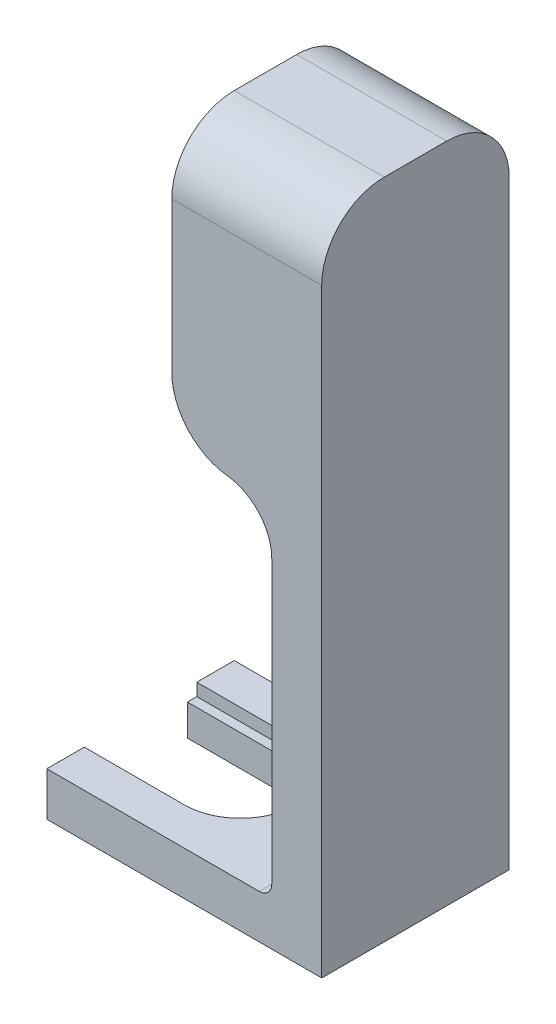
ISO-10303-21;
HEADER;
FILE_DESCRIPTION(('STEP AP214'),'2;1');
FILE_NAME('part.step','',(''),(''),'','','');
FILE_SCHEMA(('AUTOMOTIVE_DESIGN { 1 0 10303 214 1 1 1 1 }'));
ENDSEC;
DATA;
#1=APPLICATION_CONTEXT('core data for automotive mechanical design processes');
#2=APPLICATION_PROTOCOL_DEFINITION('international standard','automotive_design',2000,#1);
#3=PRODUCT_CONTEXT('',#1,'mechanical');
#4=PRODUCT('Part','Part','',(#3));
#5=PRODUCT_RELATED_PRODUCT_CATEGORY('part','',(#4));
#6=PRODUCT_DEFINITION_FORMATION('','',#4);
#7=PRODUCT_DEFINITION_CONTEXT('part definition',#1,'design');
#8=PRODUCT_DEFINITION('design','',#6,#7);
#9=PRODUCT_DEFINITION_SHAPE('','',#8);
#10=(LENGTH_UNIT() NAMED_UNIT(*) SI_UNIT(.MILLI.,.METRE.));
#11=(NAMED_UNIT(*) PLANE_ANGLE_UNIT() SI_UNIT($,.RADIAN.));
#12=(NAMED_UNIT(*) SI_UNIT($,.STERADIAN.) SOLID_ANGLE_UNIT());
#13=UNCERTAINTY_MEASURE_WITH_UNIT(LENGTH_MEASURE(1.E-05),#10,'distance_accuracy_value','');
#14=(GEOMETRIC_REPRESENTATION_CONTEXT(3) GLOBAL_UNCERTAINTY_ASSIGNED_CONTEXT((#13)) GLOBAL_UNIT_ASSIGNED_CONTEXT((#10,
#11,#12)) REPRESENTATION_CONTEXT('',''));
#15=CARTESIAN_POINT('',(0.,0.,0.));
#16=DIRECTION('',(0.,0.,1.));
#17=DIRECTION('',(1.,0.,0.));
#18=AXIS2_PLACEMENT_3D('',#15,#16,#17);
#19=CARTESIAN_POINT('',(0.,-57.5,15.));
#20=DIRECTION('',(0.,-1.,0.));
#21=DIRECTION('',(0.,0.,-1.));
#22=AXIS2_PLACEMENT_3D('',#19,#20,#21);
#23=PLANE('',#22);
#24=DIRECTION('',(-1.,0.,0.));
#25=VECTOR('',#24,1.);
#26=CARTESIAN_POINT('',(0.,-57.5,15.));
#27=LINE('',#26,#25);
#28=CARTESIAN_POINT('',(7.,-57.5,15.));
#29=VERTEX_POINT('',#28);
#30=CARTESIAN_POINT('',(-10.,-57.5,15.));
#31=VERTEX_POINT('',#30);
#32=EDGE_CURVE('E315',#29,#31,#27,.T.);
#33=ORIENTED_EDGE('',*,*,#32,.F.);
#34=DIRECTION('',(0.,0.,-1.));
#35=VECTOR('',#34,1.);
#36=CARTESIAN_POINT('',(7.,-57.5,0.));
#37=LINE('',#36,#35);
#38=CARTESIAN_POINT('',(7.,-57.5,0.));
#39=VERTEX_POINT('',#38);
#40=EDGE_CURVE('E388',#29,#39,#37,.T.);
#41=ORIENTED_EDGE('',*,*,#40,.T.);
#42=DIRECTION('',(-1.,0.,0.));
#43=VECTOR('',#42,1.);
#44=CARTESIAN_POINT('',(0.,-57.5,0.));
#45=LINE('',#44,#43);
#46=CARTESIAN_POINT('',(-10.,-57.5,0.));
#47=VERTEX_POINT('',#46);
#48=EDGE_CURVE('E329',#39,#47,#45,.T.);
#49=ORIENTED_EDGE('',*,*,#48,.T.);
#50=DIRECTION('',(0.,0.,-1.));
#51=VECTOR('',#50,1.);
#52=CARTESIAN_POINT('',(-10.,-57.5,15.));
#53=LINE('',#52,#51);
#54=CARTESIAN_POINT('',(-10.,-57.5,3.));
#55=VERTEX_POINT('',#54);
#56=EDGE_CURVE('E342',#55,#47,#53,.T.);
#57=ORIENTED_EDGE('',*,*,#56,.F.);
#58=DIRECTION('',(-1.,0.,0.));
#59=VECTOR('',#58,1.);
#60=CARTESIAN_POINT('',(0.,-57.5,3.));
#61=LINE('',#60,#59);
#62=CARTESIAN_POINT('',(-2.,-57.5,3.));
#63=VERTEX_POINT('',#62);
#64=EDGE_CURVE('E289',#63,#55,#61,.T.);
#65=ORIENTED_EDGE('',*,*,#64,.F.);
#66=CARTESIAN_POINT('',(-2.,-57.5,7.5));
#67=DIRECTION('',(0.,1.,0.));
#68=DIRECTION('',(0.,0.,1.));
#69=AXIS2_PLACEMENT_3D('',#66,#67,#68);
#70=CIRCLE('',#69,4.5);
#71=CARTESIAN_POINT('',(-2.,-57.5,12.));
#72=VERTEX_POINT('',#71);
#73=EDGE_CURVE('E272',#72,#63,#70,.T.);
#74=ORIENTED_EDGE('',*,*,#73,.F.);
#75=DIRECTION('',(1.,0.,0.));
#76=VECTOR('',#75,1.);
#77=CARTESIAN_POINT('',(0.,-57.5,12.));
#78=LINE('',#77,#76);
#79=CARTESIAN_POINT('',(-10.,-57.5,12.));
#80=VERTEX_POINT('',#79);
#81=EDGE_CURVE('E277',#80,#72,#78,.T.);
#82=ORIENTED_EDGE('',*,*,#81,.F.);
#83=EDGE_CURVE('E343',#31,#80,#53,.T.);
#84=ORIENTED_EDGE('',*,*,#83,.F.);
#85=EDGE_LOOP('',(#33,#41,#49,#57,#65,#74,#82,#84));
#86=FACE_BOUND('',#85,.T.);
#87=DIRECTION('',(0.,0.,-1.));
#88=VECTOR('',#87,1.);
#89=CARTESIAN_POINT('',(5.25,-57.5,0.));
#90=LINE('',#89,#88);
#91=CARTESIAN_POINT('',(5.25,-57.5,9.));
#92=VERTEX_POINT('',#91);
#93=CARTESIAN_POINT('',(5.25,-57.5,6.));
#94=VERTEX_POINT('',#93);
#95=EDGE_CURVE('E212',#92,#94,#90,.T.);
#96=ORIENTED_EDGE('',*,*,#95,.T.);
#97=DIRECTION('',(1.,0.,0.));
#98=VECTOR('',#97,1.);
#99=CARTESIAN_POINT('',(0.,-57.5,6.));
#100=LINE('',#99,#98);
#101=CARTESIAN_POINT('',(6.11249036979397,-57.5,6.));
#102=VERTEX_POINT('',#101);
#103=EDGE_CURVE('E225',#94,#102,#100,.T.);
#104=ORIENTED_EDGE('',*,*,#103,.T.);
#105=CARTESIAN_POINT('',(-2.,-57.5,7.5));
#106=DIRECTION('',(0.,1.,0.));
#107=DIRECTION('',(0.,0.,1.));
#108=AXIS2_PLACEMENT_3D('',#105,#106,#107);
#109=CIRCLE('',#108,8.25);
#110=CARTESIAN_POINT('',(6.11249036979397,-57.5,9.));
#111=VERTEX_POINT('',#110);
#112=EDGE_CURVE('E237',#111,#102,#109,.T.);
#113=ORIENTED_EDGE('',*,*,#112,.F.);
#114=DIRECTION('',(1.,0.,0.));
#115=VECTOR('',#114,1.);
#116=CARTESIAN_POINT('',(0.,-57.5,9.));
#117=LINE('',#116,#115);
#118=EDGE_CURVE('E235',#92,#111,#117,.T.);
#119=ORIENTED_EDGE('',*,*,#118,.F.);
#120=EDGE_LOOP('',(#96,#104,#113,#119));
#121=FACE_BOUND('',#120,.T.);
#122=ADVANCED_FACE('F44',(#86,#121),#23,.F.);
#123=CARTESIAN_POINT('',(-10.,0.,15.));
#124=DIRECTION('',(-1.,0.,0.));
#125=DIRECTION('',(0.,0.,1.));
#126=AXIS2_PLACEMENT_3D('',#123,#124,#125);
#127=PLANE('',#126);
#128=DIRECTION('',(0.,0.,1.));
#129=VECTOR('',#128,1.);
#130=CARTESIAN_POINT('',(-10.,-58.5,0.));
#131=LINE('',#130,#129);
#132=CARTESIAN_POINT('',(-10.,-58.5,11.25));
#133=VERTEX_POINT('',#132);
#134=CARTESIAN_POINT('',(-10.,-58.5,12.));
#135=VERTEX_POINT('',#134);
#136=EDGE_CURVE('E279',#133,#135,#131,.T.);
#137=ORIENTED_EDGE('',*,*,#136,.F.);
#138=DIRECTION('',(0.,1.,0.));
#139=VECTOR('',#138,1.);
#140=CARTESIAN_POINT('',(-10.,-61.001,11.25));
#141=LINE('',#140,#139);
#142=CARTESIAN_POINT('',(-10.,-61.,11.25));
#143=VERTEX_POINT('',#142);
#144=EDGE_CURVE('E263',#143,#133,#141,.T.);
#145=ORIENTED_EDGE('',*,*,#144,.F.);
#146=DIRECTION('',(0.,0.,-1.));
#147=VECTOR('',#146,1.);
#148=CARTESIAN_POINT('',(-10.,-61.,15.));
#149=LINE('',#148,#147);
#150=CARTESIAN_POINT('',(-10.,-61.,15.));
#151=VERTEX_POINT('',#150);
#152=EDGE_CURVE('E339',#151,#143,#149,.T.);
#153=ORIENTED_EDGE('',*,*,#152,.F.);
#154=DIRECTION('',(0.,1.,0.));
#155=VECTOR('',#154,1.);
#156=CARTESIAN_POINT('',(-10.,0.,15.));
#157=LINE('',#156,#155);
#158=EDGE_CURVE('E317',#151,#31,#157,.T.);
#159=ORIENTED_EDGE('',*,*,#158,.T.);
#160=ORIENTED_EDGE('',*,*,#83,.T.);
#161=DIRECTION('',(0.,1.,0.));
#162=VECTOR('',#161,1.);
#163=CARTESIAN_POINT('',(-10.,-58.5,12.));
#164=LINE('',#163,#162);
#165=EDGE_CURVE('E296',#135,#80,#164,.T.);
#166=ORIENTED_EDGE('',*,*,#165,.F.);
#167=EDGE_LOOP('',(#137,#145,#153,#159,#160,#166));
#168=FACE_BOUND('',#167,.T.);
#169=ADVANCED_FACE('F424',(#168),#127,.T.);
#170=CARTESIAN_POINT('',(0.,-61.,15.));
#171=DIRECTION('',(0.,-1.,0.));
#172=DIRECTION('',(0.,0.,-1.));
#173=AXIS2_PLACEMENT_3D('',#170,#171,#172);
#174=PLANE('',#173);
#175=ORIENTED_EDGE('',*,*,#152,.T.);
#176=DIRECTION('',(-1.,0.,0.));
#177=VECTOR('',#176,1.);
#178=CARTESIAN_POINT('',(0.,-61.,11.25));
#179=LINE('',#178,#177);
#180=CARTESIAN_POINT('',(-1.99999999999996,-61.,11.25));
#181=VERTEX_POINT('',#180);
#182=EDGE_CURVE('E250',#181,#143,#179,.T.);
#183=ORIENTED_EDGE('',*,*,#182,.F.);
#184=CARTESIAN_POINT('',(-1.99999999999999,-61.,7.5));
#185=DIRECTION('',(0.,-1.,0.));
#186=DIRECTION('',(0.,0.,-1.));
#187=AXIS2_PLACEMENT_3D('',#184,#185,#186);
#188=CIRCLE('',#187,3.75);
#189=CARTESIAN_POINT('',(-2.00000000000001,-61.,3.75));
#190=VERTEX_POINT('',#189);
#191=EDGE_CURVE('E244',#181,#190,#188,.F.);
#192=ORIENTED_EDGE('',*,*,#191,.T.);
#193=DIRECTION('',(-1.,0.,0.));
#194=VECTOR('',#193,1.);
#195=CARTESIAN_POINT('',(0.,-61.,3.75));
#196=LINE('',#195,#194);
#197=CARTESIAN_POINT('',(-10.,-61.,3.75));
#198=VERTEX_POINT('',#197);
#199=EDGE_CURVE('E262',#190,#198,#196,.T.);
#200=ORIENTED_EDGE('',*,*,#199,.T.);
#201=CARTESIAN_POINT('',(-10.,-61.,0.));
#202=VERTEX_POINT('',#201);
#203=EDGE_CURVE('E338',#198,#202,#149,.T.);
#204=ORIENTED_EDGE('',*,*,#203,.T.);
#205=DIRECTION('',(-1.,0.,0.));
#206=VECTOR('',#205,1.);
#207=CARTESIAN_POINT('',(0.,-61.,0.));
#208=LINE('',#207,#206);
#209=CARTESIAN_POINT('',(12.,-61.,0.));
#210=VERTEX_POINT('',#209);
#211=EDGE_CURVE('E311',#210,#202,#208,.T.);
#212=ORIENTED_EDGE('',*,*,#211,.F.);
#213=DIRECTION('',(0.,0.,-1.));
#214=VECTOR('',#213,1.);
#215=CARTESIAN_POINT('',(12.,-61.,15.));
#216=LINE('',#215,#214);
#217=CARTESIAN_POINT('',(12.,-61.,15.));
#218=VERTEX_POINT('',#217);
#219=EDGE_CURVE('E323',#218,#210,#216,.T.);
#220=ORIENTED_EDGE('',*,*,#219,.F.);
#221=DIRECTION('',(-1.,0.,0.));
#222=VECTOR('',#221,1.);
#223=CARTESIAN_POINT('',(0.,-61.,15.));
#224=LINE('',#223,#222);
#225=EDGE_CURVE('E320',#218,#151,#224,.T.);
#226=ORIENTED_EDGE('',*,*,#225,.T.);
#227=EDGE_LOOP('',(#175,#183,#192,#200,#204,#212,#220,#226));
#228=FACE_BOUND('',#227,.T.);
#229=ADVANCED_FACE('F433',(#228),#174,.T.);
#230=CARTESIAN_POINT('',(0.,-58.5,0.));
#231=DIRECTION('',(0.,1.,0.));
#232=DIRECTION('',(0.,0.,1.));
#233=AXIS2_PLACEMENT_3D('',#230,#231,#232);
#234=PLANE('',#233);
#235=CARTESIAN_POINT('',(-1.99999999999999,-58.5,7.5));
#236=DIRECTION('',(0.,1.,0.));
#237=DIRECTION('',(0.,0.,1.));
#238=AXIS2_PLACEMENT_3D('',#235,#236,#237);
#239=CIRCLE('',#238,3.75);
#240=CARTESIAN_POINT('',(-1.99999999999996,-58.5,11.25));
#241=VERTEX_POINT('',#240);
#242=CARTESIAN_POINT('',(-2.00000000000001,-58.5,3.75));
#243=VERTEX_POINT('',#242);
#244=EDGE_CURVE('E252',#241,#243,#239,.T.);
#245=ORIENTED_EDGE('',*,*,#244,.F.);
#246=DIRECTION('',(-1.,0.,0.));
#247=VECTOR('',#246,1.);
#248=CARTESIAN_POINT('',(0.,-58.5,11.25));
#249=LINE('',#248,#247);
#250=EDGE_CURVE('E256',#241,#133,#249,.T.);
#251=ORIENTED_EDGE('',*,*,#250,.T.);
#252=ORIENTED_EDGE('',*,*,#136,.T.);
#253=DIRECTION('',(1.,0.,0.));
#254=VECTOR('',#253,1.);
#255=CARTESIAN_POINT('',(0.,-58.5,12.));
#256=LINE('',#255,#254);
#257=CARTESIAN_POINT('',(-2.,-58.5,12.));
#258=VERTEX_POINT('',#257);
#259=EDGE_CURVE('E283',#135,#258,#256,.T.);
#260=ORIENTED_EDGE('',*,*,#259,.T.);
#261=CARTESIAN_POINT('',(-2.,-58.5,7.5));
#262=DIRECTION('',(0.,1.,0.));
#263=DIRECTION('',(0.,0.,1.));
#264=AXIS2_PLACEMENT_3D('',#261,#262,#263);
#265=CIRCLE('',#264,4.5);
#266=CARTESIAN_POINT('',(-2.,-58.5,3.));
#267=VERTEX_POINT('',#266);
#268=EDGE_CURVE('E273',#258,#267,#265,.T.);
#269=ORIENTED_EDGE('',*,*,#268,.T.);
#270=DIRECTION('',(-1.,0.,0.));
#271=VECTOR('',#270,1.);
#272=CARTESIAN_POINT('',(0.,-58.5,3.));
#273=LINE('',#272,#271);
#274=CARTESIAN_POINT('',(-10.,-58.5,3.));
#275=VERTEX_POINT('',#274);
#276=EDGE_CURVE('E276',#267,#275,#273,.T.);
#277=ORIENTED_EDGE('',*,*,#276,.T.);
#278=CARTESIAN_POINT('',(-10.,-58.5,3.75));
#279=VERTEX_POINT('',#278);
#280=EDGE_CURVE('E280',#275,#279,#131,.T.);
#281=ORIENTED_EDGE('',*,*,#280,.T.);
#282=DIRECTION('',(-1.,0.,0.));
#283=VECTOR('',#282,1.);
#284=CARTESIAN_POINT('',(0.,-58.5,3.75));
#285=LINE('',#284,#283);
#286=EDGE_CURVE('E254',#243,#279,#285,.T.);
#287=ORIENTED_EDGE('',*,*,#286,.F.);
#288=EDGE_LOOP('',(#245,#251,#252,#260,#269,#277,#281,#287));
#289=FACE_BOUND('',#288,.T.);
#290=ADVANCED_FACE('F487',(#289),#234,.T.);
#291=CARTESIAN_POINT('',(12.,0.,15.));
#292=DIRECTION('',(1.,0.,0.));
#293=DIRECTION('',(0.,1.,0.));
#294=AXIS2_PLACEMENT_3D('',#291,#292,#293);
#295=PLANE('',#294);
#296=DIRECTION('',(0.,-1.,0.));
#297=VECTOR('',#296,1.);
#298=CARTESIAN_POINT('',(12.,0.,0.));
#299=LINE('',#298,#297);
#300=CARTESIAN_POINT('',(12.,-13.,0.));
#301=VERTEX_POINT('',#300);
#302=EDGE_CURVE('E307',#301,#210,#299,.T.);
#303=ORIENTED_EDGE('',*,*,#302,.F.);
#304=CARTESIAN_POINT('',(12.,-13.,5.));
#305=DIRECTION('',(1.,0.,0.));
#306=DIRECTION('',(0.,1.,0.));
#307=AXIS2_PLACEMENT_3D('',#304,#305,#306);
#308=CIRCLE('',#307,5.);
#309=CARTESIAN_POINT('',(12.,-8.,5.));
#310=VERTEX_POINT('',#309);
#311=EDGE_CURVE('E375',#301,#310,#308,.T.);
#312=ORIENTED_EDGE('',*,*,#311,.T.);
#313=DIRECTION('',(0.,0.,-1.));
#314=VECTOR('',#313,1.);
#315=CARTESIAN_POINT('',(12.,-8.,15.));
#316=LINE('',#315,#314);
#317=CARTESIAN_POINT('',(12.,-8.,10.));
#318=VERTEX_POINT('',#317);
#319=EDGE_CURVE('E349',#318,#310,#316,.T.);
#320=ORIENTED_EDGE('',*,*,#319,.F.);
#321=CARTESIAN_POINT('',(12.,-13.,10.));
#322=DIRECTION('',(1.,0.,0.));
#323=DIRECTION('',(0.,1.,0.));
#324=AXIS2_PLACEMENT_3D('',#321,#322,#323);
#325=CIRCLE('',#324,5.);
#326=CARTESIAN_POINT('',(12.,-13.,15.));
#327=VERTEX_POINT('',#326);
#328=EDGE_CURVE('E373',#318,#327,#325,.T.);
#329=ORIENTED_EDGE('',*,*,#328,.T.);
#330=DIRECTION('',(0.,-1.,0.));
#331=VECTOR('',#330,1.);
#332=CARTESIAN_POINT('',(12.,0.,15.));
#333=LINE('',#332,#331);
#334=EDGE_CURVE('E308',#327,#218,#333,.T.);
#335=ORIENTED_EDGE('',*,*,#334,.T.);
#336=ORIENTED_EDGE('',*,*,#219,.T.);
#337=EDGE_LOOP('',(#303,#312,#320,#329,#335,#336));
#338=FACE_BOUND('',#337,.T.);
#339=ADVANCED_FACE('F437',(#338),#295,.T.);
#340=CARTESIAN_POINT('',(0.,-8.,15.));
#341=DIRECTION('',(0.,1.,0.));
#342=DIRECTION('',(0.,0.,1.));
#343=AXIS2_PLACEMENT_3D('',#340,#341,#342);
#344=PLANE('',#343);
#345=ORIENTED_EDGE('',*,*,#319,.T.);
#346=DIRECTION('',(1.,0.,0.));
#347=VECTOR('',#346,1.);
#348=CARTESIAN_POINT('',(0.,-8.,5.));
#349=LINE('',#348,#347);
#350=CARTESIAN_POINT('',(0.,-8.,5.));
#351=VERTEX_POINT('',#350);
#352=EDGE_CURVE('E380',#310,#351,#349,.F.);
#353=ORIENTED_EDGE('',*,*,#352,.T.);
#354=DIRECTION('',(0.,0.,-1.));
#355=VECTOR('',#354,1.);
#356=CARTESIAN_POINT('',(0.,-8.,15.));
#357=LINE('',#356,#355);
#358=CARTESIAN_POINT('',(0.,-8.,10.));
#359=VERTEX_POINT('',#358);
#360=EDGE_CURVE('E346',#359,#351,#357,.T.);
#361=ORIENTED_EDGE('',*,*,#360,.F.);
#362=DIRECTION('',(1.,0.,0.));
#363=VECTOR('',#362,1.);
#364=CARTESIAN_POINT('',(0.,-8.,10.));
#365=LINE('',#364,#363);
#366=EDGE_CURVE('E377',#359,#318,#365,.T.);
#367=ORIENTED_EDGE('',*,*,#366,.T.);
#368=EDGE_LOOP('',(#345,#353,#361,#367));
#369=FACE_BOUND('',#368,.T.);
#370=ADVANCED_FACE('F450',(#369),#344,.T.);
#371=CARTESIAN_POINT('',(0.,0.,15.));
#372=DIRECTION('',(1.,0.,0.));
#373=DIRECTION('',(0.,1.,0.));
#374=AXIS2_PLACEMENT_3D('',#371,#372,#373);
#375=PLANE('',#374);
#376=CARTESIAN_POINT('',(0.,-16.5,7.5));
#377=DIRECTION('',(1.,0.,0.));
#378=DIRECTION('',(0.,0.,-1.));
#379=AXIS2_PLACEMENT_3D('',#376,#377,#378);
#380=CIRCLE('',#379,3.25);
#381=CARTESIAN_POINT('',(0.,-16.5,4.25));
#382=VERTEX_POINT('',#381);
#383=EDGE_CURVE('E295',#382,#382,#380,.T.);
#384=ORIENTED_EDGE('',*,*,#383,.T.);
#385=EDGE_LOOP('',(#384));
#386=FACE_BOUND('',#385,.T.);
#387=ORIENTED_EDGE('',*,*,#360,.T.);
#388=CARTESIAN_POINT('',(0.,-13.,5.));
#389=DIRECTION('',(1.,0.,0.));
#390=DIRECTION('',(0.,1.,0.));
#391=AXIS2_PLACEMENT_3D('',#388,#389,#390);
#392=CIRCLE('',#391,5.);
#393=CARTESIAN_POINT('',(0.,-13.,0.));
#394=VERTEX_POINT('',#393);
#395=EDGE_CURVE('E384',#351,#394,#392,.F.);
#396=ORIENTED_EDGE('',*,*,#395,.T.);
#397=DIRECTION('',(0.,-1.,0.));
#398=VECTOR('',#397,1.);
#399=CARTESIAN_POINT('',(0.,0.,0.));
#400=LINE('',#399,#398);
#401=CARTESIAN_POINT('',(0.,-25.,0.));
#402=VERTEX_POINT('',#401);
#403=EDGE_CURVE('E325',#394,#402,#400,.T.);
#404=ORIENTED_EDGE('',*,*,#403,.T.);
#405=DIRECTION('',(0.,0.,-1.));
#406=VECTOR('',#405,1.);
#407=CARTESIAN_POINT('',(0.,-25.,15.));
#408=LINE('',#407,#406);
#409=CARTESIAN_POINT('',(0.,-25.,15.));
#410=VERTEX_POINT('',#409);
#411=EDGE_CURVE('E355',#402,#410,#408,.F.);
#412=ORIENTED_EDGE('',*,*,#411,.T.);
#413=DIRECTION('',(0.,-1.,0.));
#414=VECTOR('',#413,1.);
#415=CARTESIAN_POINT('',(0.,0.,15.));
#416=LINE('',#415,#414);
#417=CARTESIAN_POINT('',(0.,-13.,15.));
#418=VERTEX_POINT('',#417);
#419=EDGE_CURVE('E310',#418,#410,#416,.T.);
#420=ORIENTED_EDGE('',*,*,#419,.F.);
#421=CARTESIAN_POINT('',(0.,-13.,10.));
#422=DIRECTION('',(1.,0.,0.));
#423=DIRECTION('',(0.,1.,0.));
#424=AXIS2_PLACEMENT_3D('',#421,#422,#423);
#425=CIRCLE('',#424,5.);
#426=EDGE_CURVE('E382',#418,#359,#425,.F.);
#427=ORIENTED_EDGE('',*,*,#426,.T.);
#428=EDGE_LOOP('',(#387,#396,#404,#412,#420,#427));
#429=FACE_BOUND('',#428,.T.);
#430=ADVANCED_FACE('F447',(#386,#429),#375,.F.);
#431=CARTESIAN_POINT('',(8.,0.,15.));
#432=DIRECTION('',(1.,0.,0.));
#433=DIRECTION('',(0.,0.,-1.));
#434=AXIS2_PLACEMENT_3D('',#431,#432,#433);
#435=PLANE('',#434);
#436=DIRECTION('',(0.,-1.,0.));
#437=VECTOR('',#436,1.);
#438=CARTESIAN_POINT('',(8.,0.,0.));
#439=LINE('',#438,#437);
#440=CARTESIAN_POINT('',(8.,-33.9442719099992,0.));
#441=VERTEX_POINT('',#440);
#442=CARTESIAN_POINT('',(8.,-56.5,0.));
#443=VERTEX_POINT('',#442);
#444=EDGE_CURVE('E327',#441,#443,#439,.T.);
#445=ORIENTED_EDGE('',*,*,#444,.T.);
#446=DIRECTION('',(0.,0.,-1.));
#447=VECTOR('',#446,1.);
#448=CARTESIAN_POINT('',(8.,-56.5,15.));
#449=LINE('',#448,#447);
#450=CARTESIAN_POINT('',(8.,-56.5,15.));
#451=VERTEX_POINT('',#450);
#452=EDGE_CURVE('E65',#443,#451,#449,.F.);
#453=ORIENTED_EDGE('',*,*,#452,.T.);
#454=DIRECTION('',(0.,-1.,0.));
#455=VECTOR('',#454,1.);
#456=CARTESIAN_POINT('',(8.,0.,15.));
#457=LINE('',#456,#455);
#458=CARTESIAN_POINT('',(8.,-33.9442719099992,15.));
#459=VERTEX_POINT('',#458);
#460=EDGE_CURVE('E313',#459,#451,#457,.T.);
#461=ORIENTED_EDGE('',*,*,#460,.F.);
#462=DIRECTION('',(0.,0.,-1.));
#463=VECTOR('',#462,1.);
#464=CARTESIAN_POINT('',(8.,-33.9442719099992,15.));
#465=LINE('',#464,#463);
#466=EDGE_CURVE('E361',#459,#441,#465,.T.);
#467=ORIENTED_EDGE('',*,*,#466,.T.);
#468=EDGE_LOOP('',(#445,#453,#461,#467));
#469=FACE_BOUND('',#468,.T.);
#470=ADVANCED_FACE('F465',(#469),#435,.F.);
#471=DIRECTION('',(0.,1.,0.));
#472=VECTOR('',#471,1.);
#473=CARTESIAN_POINT('',(-10.,-61.001,3.75));
#474=LINE('',#473,#472);
#475=EDGE_CURVE('E265',#198,#279,#474,.T.);
#476=ORIENTED_EDGE('',*,*,#475,.T.);
#477=ORIENTED_EDGE('',*,*,#280,.F.);
#478=DIRECTION('',(0.,1.,0.));
#479=VECTOR('',#478,1.);
#480=CARTESIAN_POINT('',(-10.,-58.5,3.));
#481=LINE('',#480,#479);
#482=EDGE_CURVE('E298',#275,#55,#481,.T.);
#483=ORIENTED_EDGE('',*,*,#482,.T.);
#484=ORIENTED_EDGE('',*,*,#56,.T.);
#485=DIRECTION('',(0.,1.,0.));
#486=VECTOR('',#485,1.);
#487=CARTESIAN_POINT('',(-10.,0.,0.));
#488=LINE('',#487,#486);
#489=EDGE_CURVE('E331',#202,#47,#488,.T.);
#490=ORIENTED_EDGE('',*,*,#489,.F.);
#491=ORIENTED_EDGE('',*,*,#203,.F.);
#492=EDGE_LOOP('',(#476,#477,#483,#484,#490,#491));
#493=FACE_BOUND('',#492,.T.);
#494=ADVANCED_FACE('F406',(#493),#127,.T.);
#495=CARTESIAN_POINT('',(0.,0.,15.));
#496=DIRECTION('',(0.,0.,1.));
#497=DIRECTION('',(1.,0.,0.));
#498=AXIS2_PLACEMENT_3D('',#495,#496,#497);
#499=PLANE('',#498);
#500=ORIENTED_EDGE('',*,*,#334,.F.);
#501=DIRECTION('',(1.,0.,0.));
#502=VECTOR('',#501,1.);
#503=CARTESIAN_POINT('',(0.,-13.,15.));
#504=LINE('',#503,#502);
#505=EDGE_CURVE('E386',#327,#418,#504,.F.);
#506=ORIENTED_EDGE('',*,*,#505,.T.);
#507=ORIENTED_EDGE('',*,*,#419,.T.);
#508=CARTESIAN_POINT('',(5.,-25.,15.));
#509=DIRECTION('',(0.,0.,1.));
#510=DIRECTION('',(1.,0.,0.));
#511=AXIS2_PLACEMENT_3D('',#508,#509,#510);
#512=CIRCLE('',#511,5.);
#513=CARTESIAN_POINT('',(4.44444444444444,-29.9690399499995,15.));
#514=VERTEX_POINT('',#513);
#515=EDGE_CURVE('E358',#410,#514,#512,.T.);
#516=ORIENTED_EDGE('',*,*,#515,.T.);
#517=CARTESIAN_POINT('',(4.,-33.9442719099992,15.));
#518=DIRECTION('',(0.,0.,1.));
#519=DIRECTION('',(1.,0.,0.));
#520=AXIS2_PLACEMENT_3D('',#517,#518,#519);
#521=CIRCLE('',#520,4.);
#522=EDGE_CURVE('E368',#514,#459,#521,.F.);
#523=ORIENTED_EDGE('',*,*,#522,.T.);
#524=ORIENTED_EDGE('',*,*,#460,.T.);
#525=CARTESIAN_POINT('',(7.,-56.5,15.));
#526=DIRECTION('',(0.,0.,1.));
#527=DIRECTION('',(1.,0.,0.));
#528=AXIS2_PLACEMENT_3D('',#525,#526,#527);
#529=CIRCLE('',#528,1.);
#530=EDGE_CURVE('E12',#451,#29,#529,.F.);
#531=ORIENTED_EDGE('',*,*,#530,.T.);
#532=ORIENTED_EDGE('',*,*,#32,.T.);
#533=ORIENTED_EDGE('',*,*,#158,.F.);
#534=ORIENTED_EDGE('',*,*,#225,.F.);
#535=EDGE_LOOP('',(#500,#506,#507,#516,#523,#524,#531,#532,#533,#534));
#536=FACE_BOUND('',#535,.T.);
#537=ADVANCED_FACE('F430',(#536),#499,.T.);
#538=CARTESIAN_POINT('',(0.,0.,0.));
#539=DIRECTION('',(0.,0.,1.));
#540=DIRECTION('',(1.,0.,0.));
#541=AXIS2_PLACEMENT_3D('',#538,#539,#540);
#542=PLANE('',#541);
#543=ORIENTED_EDGE('',*,*,#403,.F.);
#544=DIRECTION('',(1.,0.,0.));
#545=VECTOR('',#544,1.);
#546=CARTESIAN_POINT('',(12.,-13.,0.));
#547=LINE('',#546,#545);
#548=EDGE_CURVE('E370',#394,#301,#547,.T.);
#549=ORIENTED_EDGE('',*,*,#548,.T.);
#550=ORIENTED_EDGE('',*,*,#302,.T.);
#551=ORIENTED_EDGE('',*,*,#211,.T.);
#552=ORIENTED_EDGE('',*,*,#489,.T.);
#553=ORIENTED_EDGE('',*,*,#48,.F.);
#554=CARTESIAN_POINT('',(7.,-56.5,0.));
#555=DIRECTION('',(0.,0.,1.));
#556=DIRECTION('',(1.,0.,0.));
#557=AXIS2_PLACEMENT_3D('',#554,#555,#556);
#558=CIRCLE('',#557,1.);
#559=EDGE_CURVE('E52',#39,#443,#558,.T.);
#560=ORIENTED_EDGE('',*,*,#559,.T.);
#561=ORIENTED_EDGE('',*,*,#444,.F.);
#562=CARTESIAN_POINT('',(4.,-33.9442719099992,0.));
#563=DIRECTION('',(0.,0.,1.));
#564=DIRECTION('',(1.,0.,0.));
#565=AXIS2_PLACEMENT_3D('',#562,#563,#564);
#566=CIRCLE('',#565,4.);
#567=CARTESIAN_POINT('',(4.44444444444444,-29.9690399499995,0.));
#568=VERTEX_POINT('',#567);
#569=EDGE_CURVE('E366',#441,#568,#566,.T.);
#570=ORIENTED_EDGE('',*,*,#569,.T.);
#571=CARTESIAN_POINT('',(5.,-25.,0.));
#572=DIRECTION('',(0.,0.,1.));
#573=DIRECTION('',(1.,0.,0.));
#574=AXIS2_PLACEMENT_3D('',#571,#572,#573);
#575=CIRCLE('',#574,5.);
#576=EDGE_CURVE('E352',#568,#402,#575,.F.);
#577=ORIENTED_EDGE('',*,*,#576,.T.);
#578=EDGE_LOOP('',(#543,#549,#550,#551,#552,#553,#560,#561,#570,#577));
#579=FACE_BOUND('',#578,.T.);
#580=ADVANCED_FACE('F401',(#579),#542,.F.);
#581=CARTESIAN_POINT('',(10.,0.,0.));
#582=DIRECTION('',(1.,0.,0.));
#583=DIRECTION('',(0.,0.,-1.));
#584=AXIS2_PLACEMENT_3D('',#581,#582,#583);
#585=PLANE('',#584);
#586=CARTESIAN_POINT('',(10.,-16.5,7.5));
#587=DIRECTION('',(1.,0.,0.));
#588=DIRECTION('',(0.,0.,-1.));
#589=AXIS2_PLACEMENT_3D('',#586,#587,#588);
#590=CIRCLE('',#589,3.25);
#591=CARTESIAN_POINT('',(10.,-16.5,4.25));
#592=VERTEX_POINT('',#591);
#593=EDGE_CURVE('E304',#592,#592,#590,.T.);
#594=ORIENTED_EDGE('',*,*,#593,.F.);
#595=EDGE_LOOP('',(#594));
#596=FACE_BOUND('',#595,.T.);
#597=ADVANCED_FACE('F536',(#596),#585,.F.);
#598=CARTESIAN_POINT('',(0.,-16.5,7.5));
#599=DIRECTION('',(1.,0.,0.));
#600=DIRECTION('',(0.,0.,-1.));
#601=AXIS2_PLACEMENT_3D('',#598,#599,#600);
#602=CYLINDRICAL_SURFACE('',#601,3.25);
#603=ORIENTED_EDGE('',*,*,#383,.F.);
#604=EDGE_LOOP('',(#603));
#605=FACE_BOUND('',#604,.T.);
#606=ORIENTED_EDGE('',*,*,#593,.T.);
#607=EDGE_LOOP('',(#606));
#608=FACE_BOUND('',#607,.T.);
#609=ADVANCED_FACE('F538',(#605,#608),#602,.F.);
#610=CARTESIAN_POINT('',(-2.,-58.5,7.5));
#611=DIRECTION('',(0.,1.,0.));
#612=DIRECTION('',(0.,0.,1.));
#613=AXIS2_PLACEMENT_3D('',#610,#611,#612);
#614=CYLINDRICAL_SURFACE('',#613,4.5);
#615=ORIENTED_EDGE('',*,*,#73,.T.);
#616=DIRECTION('',(0.,1.,0.));
#617=VECTOR('',#616,1.);
#618=CARTESIAN_POINT('',(-2.,-58.5,3.));
#619=LINE('',#618,#617);
#620=EDGE_CURVE('E286',#267,#63,#619,.T.);
#621=ORIENTED_EDGE('',*,*,#620,.F.);
#622=ORIENTED_EDGE('',*,*,#268,.F.);
#623=DIRECTION('',(0.,1.,0.));
#624=VECTOR('',#623,1.);
#625=CARTESIAN_POINT('',(-2.,-58.5,12.));
#626=LINE('',#625,#624);
#627=EDGE_CURVE('E293',#258,#72,#626,.T.);
#628=ORIENTED_EDGE('',*,*,#627,.T.);
#629=EDGE_LOOP('',(#615,#621,#622,#628));
#630=FACE_BOUND('',#629,.T.);
#631=ADVANCED_FACE('F417',(#630),#614,.F.);
#632=CARTESIAN_POINT('',(0.,-58.5,12.));
#633=DIRECTION('',(0.,0.,1.));
#634=DIRECTION('',(1.,0.,0.));
#635=AXIS2_PLACEMENT_3D('',#632,#633,#634);
#636=PLANE('',#635);
#637=ORIENTED_EDGE('',*,*,#81,.T.);
#638=ORIENTED_EDGE('',*,*,#627,.F.);
#639=ORIENTED_EDGE('',*,*,#259,.F.);
#640=ORIENTED_EDGE('',*,*,#165,.T.);
#641=EDGE_LOOP('',(#637,#638,#639,#640));
#642=FACE_BOUND('',#641,.T.);
#643=ADVANCED_FACE('F420',(#642),#636,.F.);
#644=CARTESIAN_POINT('',(0.,-58.5,3.));
#645=DIRECTION('',(0.,0.,-1.));
#646=DIRECTION('',(-1.,0.,0.));
#647=AXIS2_PLACEMENT_3D('',#644,#645,#646);
#648=PLANE('',#647);
#649=ORIENTED_EDGE('',*,*,#64,.T.);
#650=ORIENTED_EDGE('',*,*,#482,.F.);
#651=ORIENTED_EDGE('',*,*,#276,.F.);
#652=ORIENTED_EDGE('',*,*,#620,.T.);
#653=EDGE_LOOP('',(#649,#650,#651,#652));
#654=FACE_BOUND('',#653,.T.);
#655=ADVANCED_FACE('F413',(#654),#648,.F.);
#656=CARTESIAN_POINT('',(-1.99999999999999,-61.001,7.5));
#657=DIRECTION('',(0.,1.,0.));
#658=DIRECTION('',(0.,0.,1.));
#659=AXIS2_PLACEMENT_3D('',#656,#657,#658);
#660=CYLINDRICAL_SURFACE('',#659,3.75);
#661=DIRECTION('',(0.,1.,0.));
#662=VECTOR('',#661,1.);
#663=CARTESIAN_POINT('',(-1.99999999999996,-61.001,11.25));
#664=LINE('',#663,#662);
#665=EDGE_CURVE('E260',#181,#241,#664,.T.);
#666=ORIENTED_EDGE('',*,*,#665,.T.);
#667=ORIENTED_EDGE('',*,*,#244,.T.);
#668=DIRECTION('',(0.,1.,0.));
#669=VECTOR('',#668,1.);
#670=CARTESIAN_POINT('',(-2.00000000000001,-61.001,3.75));
#671=LINE('',#670,#669);
#672=EDGE_CURVE('E259',#190,#243,#671,.T.);
#673=ORIENTED_EDGE('',*,*,#672,.F.);
#674=ORIENTED_EDGE('',*,*,#191,.F.);
#675=EDGE_LOOP('',(#666,#667,#673,#674));
#676=FACE_BOUND('',#675,.T.);
#677=ADVANCED_FACE('F576',(#676),#660,.F.);
#678=CARTESIAN_POINT('',(0.,-61.001,11.25));
#679=DIRECTION('',(0.,0.,-1.));
#680=DIRECTION('',(-1.,0.,0.));
#681=AXIS2_PLACEMENT_3D('',#678,#679,#680);
#682=PLANE('',#681);
#683=ORIENTED_EDGE('',*,*,#182,.T.);
#684=ORIENTED_EDGE('',*,*,#144,.T.);
#685=ORIENTED_EDGE('',*,*,#250,.F.);
#686=ORIENTED_EDGE('',*,*,#665,.F.);
#687=EDGE_LOOP('',(#683,#684,#685,#686));
#688=FACE_BOUND('',#687,.T.);
#689=ADVANCED_FACE('F584',(#688),#682,.T.);
#690=CARTESIAN_POINT('',(0.,-61.001,3.75));
#691=DIRECTION('',(0.,0.,-1.));
#692=DIRECTION('',(-1.,0.,0.));
#693=AXIS2_PLACEMENT_3D('',#690,#691,#692);
#694=PLANE('',#693);
#695=ORIENTED_EDGE('',*,*,#672,.T.);
#696=ORIENTED_EDGE('',*,*,#286,.T.);
#697=ORIENTED_EDGE('',*,*,#475,.F.);
#698=ORIENTED_EDGE('',*,*,#199,.F.);
#699=EDGE_LOOP('',(#695,#696,#697,#698));
#700=FACE_BOUND('',#699,.T.);
#701=ADVANCED_FACE('F593',(#700),#694,.F.);
#702=CARTESIAN_POINT('',(5.25,-60.,0.));
#703=DIRECTION('',(1.,0.,0.));
#704=DIRECTION('',(0.,0.,-1.));
#705=AXIS2_PLACEMENT_3D('',#702,#703,#704);
#706=PLANE('',#705);
#707=ORIENTED_EDGE('',*,*,#95,.F.);
#708=DIRECTION('',(0.,1.,0.));
#709=VECTOR('',#708,1.);
#710=CARTESIAN_POINT('',(5.25,-60.,9.));
#711=LINE('',#710,#709);
#712=CARTESIAN_POINT('',(5.25,-60.,9.));
#713=VERTEX_POINT('',#712);
#714=EDGE_CURVE('E205',#713,#92,#711,.T.);
#715=ORIENTED_EDGE('',*,*,#714,.F.);
#716=DIRECTION('',(0.,0.,-1.));
#717=VECTOR('',#716,1.);
#718=CARTESIAN_POINT('',(5.25,-60.,0.));
#719=LINE('',#718,#717);
#720=CARTESIAN_POINT('',(5.25,-60.,6.));
#721=VERTEX_POINT('',#720);
#722=EDGE_CURVE('E209',#713,#721,#719,.T.);
#723=ORIENTED_EDGE('',*,*,#722,.T.);
#724=DIRECTION('',(0.,1.,0.));
#725=VECTOR('',#724,1.);
#726=CARTESIAN_POINT('',(5.25,-60.,6.));
#727=LINE('',#726,#725);
#728=EDGE_CURVE('E242',#721,#94,#727,.T.);
#729=ORIENTED_EDGE('',*,*,#728,.T.);
#730=EDGE_LOOP('',(#707,#715,#723,#729));
#731=FACE_BOUND('',#730,.T.);
#732=ADVANCED_FACE('F207',(#731),#706,.T.);
#733=CARTESIAN_POINT('',(0.,-60.,6.));
#734=DIRECTION('',(0.,0.,1.));
#735=DIRECTION('',(1.,0.,0.));
#736=AXIS2_PLACEMENT_3D('',#733,#734,#735);
#737=PLANE('',#736);
#738=ORIENTED_EDGE('',*,*,#103,.F.);
#739=ORIENTED_EDGE('',*,*,#728,.F.);
#740=DIRECTION('',(1.,0.,0.));
#741=VECTOR('',#740,1.);
#742=CARTESIAN_POINT('',(0.,-60.,6.));
#743=LINE('',#742,#741);
#744=CARTESIAN_POINT('',(6.11249036979397,-60.,6.));
#745=VERTEX_POINT('',#744);
#746=EDGE_CURVE('E218',#721,#745,#743,.T.);
#747=ORIENTED_EDGE('',*,*,#746,.T.);
#748=DIRECTION('',(0.,1.,0.));
#749=VECTOR('',#748,1.);
#750=CARTESIAN_POINT('',(6.11249036979397,-60.,6.));
#751=LINE('',#750,#749);
#752=EDGE_CURVE('E245',#745,#102,#751,.T.);
#753=ORIENTED_EDGE('',*,*,#752,.T.);
#754=EDGE_LOOP('',(#738,#739,#747,#753));
#755=FACE_BOUND('',#754,.T.);
#756=ADVANCED_FACE('F607',(#755),#737,.T.);
#757=CARTESIAN_POINT('',(-2.,-60.,7.5));
#758=DIRECTION('',(0.,1.,0.));
#759=DIRECTION('',(0.,0.,1.));
#760=AXIS2_PLACEMENT_3D('',#757,#758,#759);
#761=CYLINDRICAL_SURFACE('',#760,8.25);
#762=ORIENTED_EDGE('',*,*,#112,.T.);
#763=ORIENTED_EDGE('',*,*,#752,.F.);
#764=CARTESIAN_POINT('',(-2.,-60.,7.5));
#765=DIRECTION('',(0.,1.,0.));
#766=DIRECTION('',(0.,0.,1.));
#767=AXIS2_PLACEMENT_3D('',#764,#765,#766);
#768=CIRCLE('',#767,8.25);
#769=CARTESIAN_POINT('',(6.11249036979397,-60.,9.));
#770=VERTEX_POINT('',#769);
#771=EDGE_CURVE('E229',#770,#745,#768,.T.);
#772=ORIENTED_EDGE('',*,*,#771,.F.);
#773=DIRECTION('',(0.,1.,0.));
#774=VECTOR('',#773,1.);
#775=CARTESIAN_POINT('',(6.11249036979397,-60.,9.));
#776=LINE('',#775,#774);
#777=EDGE_CURVE('E217',#770,#111,#776,.T.);
#778=ORIENTED_EDGE('',*,*,#777,.T.);
#779=EDGE_LOOP('',(#762,#763,#772,#778));
#780=FACE_BOUND('',#779,.T.);
#781=ADVANCED_FACE('F614',(#780),#761,.F.);
#782=CARTESIAN_POINT('',(0.,-60.,9.));
#783=DIRECTION('',(0.,0.,1.));
#784=DIRECTION('',(1.,0.,0.));
#785=AXIS2_PLACEMENT_3D('',#782,#783,#784);
#786=PLANE('',#785);
#787=ORIENTED_EDGE('',*,*,#118,.T.);
#788=ORIENTED_EDGE('',*,*,#777,.F.);
#789=DIRECTION('',(1.,0.,0.));
#790=VECTOR('',#789,1.);
#791=CARTESIAN_POINT('',(0.,-60.,9.));
#792=LINE('',#791,#790);
#793=EDGE_CURVE('E224',#713,#770,#792,.T.);
#794=ORIENTED_EDGE('',*,*,#793,.F.);
#795=ORIENTED_EDGE('',*,*,#714,.T.);
#796=EDGE_LOOP('',(#787,#788,#794,#795));
#797=FACE_BOUND('',#796,.T.);
#798=ADVANCED_FACE('F227',(#797),#786,.F.);
#799=CARTESIAN_POINT('',(0.,-60.,0.));
#800=DIRECTION('',(0.,1.,0.));
#801=DIRECTION('',(0.,0.,1.));
#802=AXIS2_PLACEMENT_3D('',#799,#800,#801);
#803=PLANE('',#802);
#804=ORIENTED_EDGE('',*,*,#722,.F.);
#805=ORIENTED_EDGE('',*,*,#793,.T.);
#806=ORIENTED_EDGE('',*,*,#771,.T.);
#807=ORIENTED_EDGE('',*,*,#746,.F.);
#808=EDGE_LOOP('',(#804,#805,#806,#807));
#809=FACE_BOUND('',#808,.T.);
#810=ADVANCED_FACE('F222',(#809),#803,.T.);
#811=CARTESIAN_POINT('',(5.,-25.,15.));
#812=DIRECTION('',(0.,0.,-1.));
#813=DIRECTION('',(-1.,0.,0.));
#814=AXIS2_PLACEMENT_3D('',#811,#812,#813);
#815=CYLINDRICAL_SURFACE('',#814,5.);
#816=ORIENTED_EDGE('',*,*,#576,.F.);
#817=DIRECTION('',(0.,0.,-1.));
#818=VECTOR('',#817,1.);
#819=CARTESIAN_POINT('',(4.44444444444444,-29.9690399499995,15.));
#820=LINE('',#819,#818);
#821=EDGE_CURVE('E364',#568,#514,#820,.F.);
#822=ORIENTED_EDGE('',*,*,#821,.T.);
#823=ORIENTED_EDGE('',*,*,#515,.F.);
#824=ORIENTED_EDGE('',*,*,#411,.F.);
#825=EDGE_LOOP('',(#816,#822,#823,#824));
#826=FACE_BOUND('',#825,.T.);
#827=ADVANCED_FACE('F460',(#826),#815,.T.);
#828=CARTESIAN_POINT('',(4.,-33.9442719099992,15.));
#829=DIRECTION('',(0.,0.,-1.));
#830=DIRECTION('',(-1.,0.,0.));
#831=AXIS2_PLACEMENT_3D('',#828,#829,#830);
#832=CYLINDRICAL_SURFACE('',#831,4.);
#833=ORIENTED_EDGE('',*,*,#522,.F.);
#834=ORIENTED_EDGE('',*,*,#821,.F.);
#835=ORIENTED_EDGE('',*,*,#569,.F.);
#836=ORIENTED_EDGE('',*,*,#466,.F.);
#837=EDGE_LOOP('',(#833,#834,#835,#836));
#838=FACE_BOUND('',#837,.T.);
#839=ADVANCED_FACE('F464',(#838),#832,.F.);
#840=CARTESIAN_POINT('',(0.,-13.,5.));
#841=DIRECTION('',(-1.,0.,0.));
#842=DIRECTION('',(0.,0.,1.));
#843=AXIS2_PLACEMENT_3D('',#840,#841,#842);
#844=CYLINDRICAL_SURFACE('',#843,5.);
#845=ORIENTED_EDGE('',*,*,#395,.F.);
#846=ORIENTED_EDGE('',*,*,#352,.F.);
#847=ORIENTED_EDGE('',*,*,#311,.F.);
#848=ORIENTED_EDGE('',*,*,#548,.F.);
#849=EDGE_LOOP('',(#845,#846,#847,#848));
#850=FACE_BOUND('',#849,.T.);
#851=ADVANCED_FACE('F453',(#850),#844,.T.);
#852=CARTESIAN_POINT('',(0.,-13.,10.));
#853=DIRECTION('',(1.,0.,0.));
#854=DIRECTION('',(0.,0.,-1.));
#855=AXIS2_PLACEMENT_3D('',#852,#853,#854);
#856=CYLINDRICAL_SURFACE('',#855,5.);
#857=ORIENTED_EDGE('',*,*,#426,.F.);
#858=ORIENTED_EDGE('',*,*,#505,.F.);
#859=ORIENTED_EDGE('',*,*,#328,.F.);
#860=ORIENTED_EDGE('',*,*,#366,.F.);
#861=EDGE_LOOP('',(#857,#858,#859,#860));
#862=FACE_BOUND('',#861,.T.);
#863=ADVANCED_FACE('F443',(#862),#856,.T.);
#864=CARTESIAN_POINT('',(7.,-56.5,15.));
#865=DIRECTION('',(0.,0.,1.));
#866=DIRECTION('',(1.,0.,0.));
#867=AXIS2_PLACEMENT_3D('',#864,#865,#866);
#868=CYLINDRICAL_SURFACE('',#867,1.);
#869=ORIENTED_EDGE('',*,*,#530,.F.);
#870=ORIENTED_EDGE('',*,*,#452,.F.);
#871=ORIENTED_EDGE('',*,*,#559,.F.);
#872=ORIENTED_EDGE('',*,*,#40,.F.);
#873=EDGE_LOOP('',(#869,#870,#871,#872));
#874=FACE_BOUND('',#873,.T.);
#875=ADVANCED_FACE('F46',(#874),#868,.F.);
#876=CLOSED_SHELL('',(#122,#169,#229,#290,#339,#370,#430,#470,#494,#537,#580,#597,#609,#631,
#643,#655,#677,#689,#701,#732,#756,#781,#798,#810,#827,#839,#851,#863,#875));
#877=MANIFOLD_SOLID_BREP('B2',#876);
#878=ADVANCED_BREP_SHAPE_REPRESENTATION('',(#18,#877),#14);
#879=SHAPE_DEFINITION_REPRESENTATION(#9,#878);
ENDSEC;
END-ISO-10303-21;
